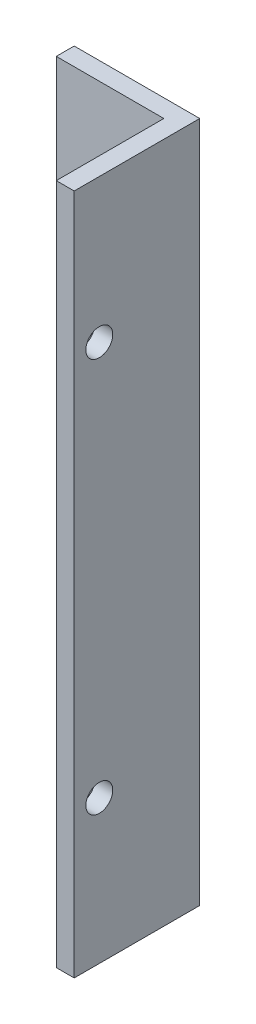
ISO-10303-21;
HEADER;
FILE_DESCRIPTION(('STEP AP214'),'2;1');
FILE_NAME('part.step','',(''),(''),'','','');
FILE_SCHEMA(('AUTOMOTIVE_DESIGN { 1 0 10303 214 1 1 1 1 }'));
ENDSEC;
DATA;
#1=APPLICATION_CONTEXT('core data for automotive mechanical design processes');
#2=APPLICATION_PROTOCOL_DEFINITION('international standard','automotive_design',2000,#1);
#3=PRODUCT_CONTEXT('',#1,'mechanical');
#4=PRODUCT('Part','Part','',(#3));
#5=PRODUCT_RELATED_PRODUCT_CATEGORY('part','',(#4));
#6=PRODUCT_DEFINITION_FORMATION('','',#4);
#7=PRODUCT_DEFINITION_CONTEXT('part definition',#1,'design');
#8=PRODUCT_DEFINITION('design','',#6,#7);
#9=PRODUCT_DEFINITION_SHAPE('','',#8);
#10=(LENGTH_UNIT() NAMED_UNIT(*) SI_UNIT(.MILLI.,.METRE.));
#11=(NAMED_UNIT(*) PLANE_ANGLE_UNIT() SI_UNIT($,.RADIAN.));
#12=(NAMED_UNIT(*) SI_UNIT($,.STERADIAN.) SOLID_ANGLE_UNIT());
#13=UNCERTAINTY_MEASURE_WITH_UNIT(LENGTH_MEASURE(1.E-05),#10,'distance_accuracy_value','');
#14=(GEOMETRIC_REPRESENTATION_CONTEXT(3) GLOBAL_UNCERTAINTY_ASSIGNED_CONTEXT((#13)) GLOBAL_UNIT_ASSIGNED_CONTEXT((#10,
#11,#12)) REPRESENTATION_CONTEXT('',''));
#15=CARTESIAN_POINT('',(0.,0.,0.));
#16=DIRECTION('',(0.,0.,1.));
#17=DIRECTION('',(1.,0.,0.));
#18=AXIS2_PLACEMENT_3D('',#15,#16,#17);
#19=CARTESIAN_POINT('',(-2.,76.,0.));
#20=DIRECTION('',(0.,0.,-1.));
#21=DIRECTION('',(-1.,0.,0.));
#22=AXIS2_PLACEMENT_3D('',#19,#20,#21);
#23=PLANE('',#22);
#24=DIRECTION('',(1.,0.,0.));
#25=VECTOR('',#24,1.);
#26=CARTESIAN_POINT('',(-2.,0.,0.));
#27=LINE('',#26,#25);
#28=CARTESIAN_POINT('',(-2.,0.,0.));
#29=VERTEX_POINT('',#28);
#30=CARTESIAN_POINT('',(0.,0.,0.));
#31=VERTEX_POINT('',#30);
#32=EDGE_CURVE('E121',#29,#31,#27,.T.);
#33=ORIENTED_EDGE('',*,*,#32,.T.);
#34=DIRECTION('',(0.,-1.,0.));
#35=VECTOR('',#34,1.);
#36=CARTESIAN_POINT('',(0.,76.,0.));
#37=LINE('',#36,#35);
#38=CARTESIAN_POINT('',(0.,76.,0.));
#39=VERTEX_POINT('',#38);
#40=EDGE_CURVE('E11',#39,#31,#37,.T.);
#41=ORIENTED_EDGE('',*,*,#40,.F.);
#42=DIRECTION('',(1.,0.,0.));
#43=VECTOR('',#42,1.);
#44=CARTESIAN_POINT('',(-2.,76.,0.));
#45=LINE('',#44,#43);
#46=CARTESIAN_POINT('',(-2.,76.,0.));
#47=VERTEX_POINT('',#46);
#48=EDGE_CURVE('E132',#47,#39,#45,.T.);
#49=ORIENTED_EDGE('',*,*,#48,.F.);
#50=DIRECTION('',(0.,-1.,0.));
#51=VECTOR('',#50,1.);
#52=CARTESIAN_POINT('',(-2.,76.,0.));
#53=LINE('',#52,#51);
#54=EDGE_CURVE('E117',#47,#29,#53,.T.);
#55=ORIENTED_EDGE('',*,*,#54,.T.);
#56=EDGE_LOOP('',(#33,#41,#49,#55));
#57=FACE_BOUND('',#56,.T.);
#58=ADVANCED_FACE('F35',(#57),#23,.F.);
#59=CARTESIAN_POINT('',(0.,76.,0.));
#60=DIRECTION('',(-1.,0.,0.));
#61=DIRECTION('',(0.,0.,1.));
#62=AXIS2_PLACEMENT_3D('',#59,#60,#61);
#63=PLANE('',#62);
#64=CARTESIAN_POINT('',(0.,60.,-2.8));
#65=DIRECTION('',(1.,0.,0.));
#66=DIRECTION('',(0.,0.,-1.));
#67=AXIS2_PLACEMENT_3D('',#64,#65,#66);
#68=CIRCLE('',#67,1.5);
#69=CARTESIAN_POINT('',(0.,60.,-4.3));
#70=VERTEX_POINT('',#69);
#71=EDGE_CURVE('E141',#70,#70,#68,.T.);
#72=ORIENTED_EDGE('',*,*,#71,.F.);
#73=EDGE_LOOP('',(#72));
#74=FACE_BOUND('',#73,.T.);
#75=CARTESIAN_POINT('',(0.,16.,-2.8));
#76=DIRECTION('',(1.,0.,0.));
#77=DIRECTION('',(0.,0.,-1.));
#78=AXIS2_PLACEMENT_3D('',#75,#76,#77);
#79=CIRCLE('',#78,1.5);
#80=CARTESIAN_POINT('',(0.,16.,-4.3));
#81=VERTEX_POINT('',#80);
#82=EDGE_CURVE('E149',#81,#81,#79,.T.);
#83=ORIENTED_EDGE('',*,*,#82,.F.);
#84=EDGE_LOOP('',(#83));
#85=FACE_BOUND('',#84,.T.);
#86=DIRECTION('',(0.,0.,-1.));
#87=VECTOR('',#86,1.);
#88=CARTESIAN_POINT('',(0.,0.,0.));
#89=LINE('',#88,#87);
#90=CARTESIAN_POINT('',(0.,0.,-14.));
#91=VERTEX_POINT('',#90);
#92=EDGE_CURVE('E124',#31,#91,#89,.T.);
#93=ORIENTED_EDGE('',*,*,#92,.T.);
#94=DIRECTION('',(0.,-1.,0.));
#95=VECTOR('',#94,1.);
#96=CARTESIAN_POINT('',(0.,76.,-14.));
#97=LINE('',#96,#95);
#98=CARTESIAN_POINT('',(0.,76.,-14.));
#99=VERTEX_POINT('',#98);
#100=EDGE_CURVE('E44',#99,#91,#97,.T.);
#101=ORIENTED_EDGE('',*,*,#100,.F.);
#102=DIRECTION('',(0.,0.,-1.));
#103=VECTOR('',#102,1.);
#104=CARTESIAN_POINT('',(0.,76.,0.));
#105=LINE('',#104,#103);
#106=EDGE_CURVE('E90',#39,#99,#105,.T.);
#107=ORIENTED_EDGE('',*,*,#106,.F.);
#108=ORIENTED_EDGE('',*,*,#40,.T.);
#109=EDGE_LOOP('',(#93,#101,#107,#108));
#110=FACE_BOUND('',#109,.T.);
#111=ADVANCED_FACE('F165',(#74,#85,#110),#63,.F.);
#112=CARTESIAN_POINT('',(0.,76.,-14.));
#113=DIRECTION('',(0.,0.,1.));
#114=DIRECTION('',(1.,0.,0.));
#115=AXIS2_PLACEMENT_3D('',#112,#113,#114);
#116=PLANE('',#115);
#117=CARTESIAN_POINT('',(-7.,23.,-14.));
#118=DIRECTION('',(0.,0.,-1.));
#119=DIRECTION('',(-1.,0.,0.));
#120=AXIS2_PLACEMENT_3D('',#117,#118,#119);
#121=CIRCLE('',#120,2.5);
#122=CARTESIAN_POINT('',(-9.5,23.,-14.));
#123=VERTEX_POINT('',#122);
#124=EDGE_CURVE('E145',#123,#123,#121,.T.);
#125=ORIENTED_EDGE('',*,*,#124,.F.);
#126=EDGE_LOOP('',(#125));
#127=FACE_BOUND('',#126,.T.);
#128=CARTESIAN_POINT('',(-7.,53.,-14.));
#129=DIRECTION('',(0.,0.,-1.));
#130=DIRECTION('',(-1.,0.,0.));
#131=AXIS2_PLACEMENT_3D('',#128,#129,#130);
#132=CIRCLE('',#131,2.5);
#133=CARTESIAN_POINT('',(-9.5,53.,-14.));
#134=VERTEX_POINT('',#133);
#135=EDGE_CURVE('E151',#134,#134,#132,.T.);
#136=ORIENTED_EDGE('',*,*,#135,.F.);
#137=EDGE_LOOP('',(#136));
#138=FACE_BOUND('',#137,.T.);
#139=DIRECTION('',(-1.,0.,0.));
#140=VECTOR('',#139,1.);
#141=CARTESIAN_POINT('',(0.,0.,-14.));
#142=LINE('',#141,#140);
#143=CARTESIAN_POINT('',(-14.,0.,-14.));
#144=VERTEX_POINT('',#143);
#145=EDGE_CURVE('E127',#91,#144,#142,.T.);
#146=ORIENTED_EDGE('',*,*,#145,.T.);
#147=DIRECTION('',(0.,-1.,0.));
#148=VECTOR('',#147,1.);
#149=CARTESIAN_POINT('',(-14.,76.,-14.));
#150=LINE('',#149,#148);
#151=CARTESIAN_POINT('',(-14.,76.,-14.));
#152=VERTEX_POINT('',#151);
#153=EDGE_CURVE('E112',#152,#144,#150,.T.);
#154=ORIENTED_EDGE('',*,*,#153,.F.);
#155=DIRECTION('',(-1.,0.,0.));
#156=VECTOR('',#155,1.);
#157=CARTESIAN_POINT('',(0.,76.,-14.));
#158=LINE('',#157,#156);
#159=EDGE_CURVE('E103',#99,#152,#158,.T.);
#160=ORIENTED_EDGE('',*,*,#159,.F.);
#161=ORIENTED_EDGE('',*,*,#100,.T.);
#162=EDGE_LOOP('',(#146,#154,#160,#161));
#163=FACE_BOUND('',#162,.T.);
#164=ADVANCED_FACE('F168',(#127,#138,#163),#116,.F.);
#165=CARTESIAN_POINT('',(-14.,76.,-14.));
#166=DIRECTION('',(1.,0.,0.));
#167=DIRECTION('',(0.,0.,-1.));
#168=AXIS2_PLACEMENT_3D('',#165,#166,#167);
#169=PLANE('',#168);
#170=DIRECTION('',(0.,0.,1.));
#171=VECTOR('',#170,1.);
#172=CARTESIAN_POINT('',(-14.,0.,-14.));
#173=LINE('',#172,#171);
#174=CARTESIAN_POINT('',(-14.,0.,-12.));
#175=VERTEX_POINT('',#174);
#176=EDGE_CURVE('E111',#144,#175,#173,.T.);
#177=ORIENTED_EDGE('',*,*,#176,.T.);
#178=DIRECTION('',(0.,-1.,0.));
#179=VECTOR('',#178,1.);
#180=CARTESIAN_POINT('',(-14.,76.,-12.));
#181=LINE('',#180,#179);
#182=CARTESIAN_POINT('',(-14.,76.,-12.));
#183=VERTEX_POINT('',#182);
#184=EDGE_CURVE('E108',#183,#175,#181,.T.);
#185=ORIENTED_EDGE('',*,*,#184,.F.);
#186=DIRECTION('',(0.,0.,1.));
#187=VECTOR('',#186,1.);
#188=CARTESIAN_POINT('',(-14.,76.,-14.));
#189=LINE('',#188,#187);
#190=EDGE_CURVE('E97',#152,#183,#189,.T.);
#191=ORIENTED_EDGE('',*,*,#190,.F.);
#192=ORIENTED_EDGE('',*,*,#153,.T.);
#193=EDGE_LOOP('',(#177,#185,#191,#192));
#194=FACE_BOUND('',#193,.T.);
#195=ADVANCED_FACE('F109',(#194),#169,.F.);
#196=CARTESIAN_POINT('',(-14.,76.,-12.));
#197=DIRECTION('',(0.,0.,-1.));
#198=DIRECTION('',(-1.,0.,0.));
#199=AXIS2_PLACEMENT_3D('',#196,#197,#198);
#200=PLANE('',#199);
#201=CARTESIAN_POINT('',(-7.,23.,-12.));
#202=DIRECTION('',(0.,0.,-1.));
#203=DIRECTION('',(-1.,0.,0.));
#204=AXIS2_PLACEMENT_3D('',#201,#202,#203);
#205=CIRCLE('',#204,2.5);
#206=CARTESIAN_POINT('',(-9.5,23.,-12.));
#207=VERTEX_POINT('',#206);
#208=EDGE_CURVE('E38',#207,#207,#205,.T.);
#209=ORIENTED_EDGE('',*,*,#208,.T.);
#210=EDGE_LOOP('',(#209));
#211=FACE_BOUND('',#210,.T.);
#212=CARTESIAN_POINT('',(-7.,53.,-12.));
#213=DIRECTION('',(0.,0.,-1.));
#214=DIRECTION('',(-1.,0.,0.));
#215=AXIS2_PLACEMENT_3D('',#212,#213,#214);
#216=CIRCLE('',#215,2.5);
#217=CARTESIAN_POINT('',(-9.5,53.,-12.));
#218=VERTEX_POINT('',#217);
#219=EDGE_CURVE('E143',#218,#218,#216,.T.);
#220=ORIENTED_EDGE('',*,*,#219,.T.);
#221=EDGE_LOOP('',(#220));
#222=FACE_BOUND('',#221,.T.);
#223=DIRECTION('',(1.,0.,0.));
#224=VECTOR('',#223,1.);
#225=CARTESIAN_POINT('',(-14.,0.,-12.));
#226=LINE('',#225,#224);
#227=CARTESIAN_POINT('',(-2.,0.,-12.));
#228=VERTEX_POINT('',#227);
#229=EDGE_CURVE('E76',#175,#228,#226,.T.);
#230=ORIENTED_EDGE('',*,*,#229,.T.);
#231=DIRECTION('',(0.,-1.,0.));
#232=VECTOR('',#231,1.);
#233=CARTESIAN_POINT('',(-2.,76.,-12.));
#234=LINE('',#233,#232);
#235=CARTESIAN_POINT('',(-2.,76.,-12.));
#236=VERTEX_POINT('',#235);
#237=EDGE_CURVE('E113',#236,#228,#234,.T.);
#238=ORIENTED_EDGE('',*,*,#237,.F.);
#239=DIRECTION('',(1.,0.,0.));
#240=VECTOR('',#239,1.);
#241=CARTESIAN_POINT('',(-14.,76.,-12.));
#242=LINE('',#241,#240);
#243=EDGE_CURVE('E101',#183,#236,#242,.T.);
#244=ORIENTED_EDGE('',*,*,#243,.F.);
#245=ORIENTED_EDGE('',*,*,#184,.T.);
#246=EDGE_LOOP('',(#230,#238,#244,#245));
#247=FACE_BOUND('',#246,.T.);
#248=ADVANCED_FACE('F115',(#211,#222,#247),#200,.F.);
#249=CARTESIAN_POINT('',(-2.,76.,-12.));
#250=DIRECTION('',(1.,0.,0.));
#251=DIRECTION('',(0.,0.,-1.));
#252=AXIS2_PLACEMENT_3D('',#249,#250,#251);
#253=PLANE('',#252);
#254=CARTESIAN_POINT('',(-2.,60.,-2.8));
#255=DIRECTION('',(1.,0.,0.));
#256=DIRECTION('',(0.,0.,-1.));
#257=AXIS2_PLACEMENT_3D('',#254,#255,#256);
#258=CIRCLE('',#257,1.5);
#259=CARTESIAN_POINT('',(-2.,60.,-4.3));
#260=VERTEX_POINT('',#259);
#261=EDGE_CURVE('E125',#260,#260,#258,.T.);
#262=ORIENTED_EDGE('',*,*,#261,.T.);
#263=EDGE_LOOP('',(#262));
#264=FACE_BOUND('',#263,.T.);
#265=CARTESIAN_POINT('',(-2.,16.,-2.8));
#266=DIRECTION('',(1.,0.,0.));
#267=DIRECTION('',(0.,0.,-1.));
#268=AXIS2_PLACEMENT_3D('',#265,#266,#267);
#269=CIRCLE('',#268,1.5);
#270=CARTESIAN_POINT('',(-2.,16.,-4.3));
#271=VERTEX_POINT('',#270);
#272=EDGE_CURVE('E138',#271,#271,#269,.T.);
#273=ORIENTED_EDGE('',*,*,#272,.T.);
#274=EDGE_LOOP('',(#273));
#275=FACE_BOUND('',#274,.T.);
#276=DIRECTION('',(0.,0.,1.));
#277=VECTOR('',#276,1.);
#278=CARTESIAN_POINT('',(-2.,0.,-12.));
#279=LINE('',#278,#277);
#280=EDGE_CURVE('E82',#228,#29,#279,.T.);
#281=ORIENTED_EDGE('',*,*,#280,.T.);
#282=ORIENTED_EDGE('',*,*,#54,.F.);
#283=DIRECTION('',(0.,0.,1.));
#284=VECTOR('',#283,1.);
#285=CARTESIAN_POINT('',(-2.,76.,-12.));
#286=LINE('',#285,#284);
#287=EDGE_CURVE('E53',#236,#47,#286,.T.);
#288=ORIENTED_EDGE('',*,*,#287,.F.);
#289=ORIENTED_EDGE('',*,*,#237,.T.);
#290=EDGE_LOOP('',(#281,#282,#288,#289));
#291=FACE_BOUND('',#290,.T.);
#292=ADVANCED_FACE('F173',(#264,#275,#291),#253,.F.);
#293=CARTESIAN_POINT('',(0.,76.,0.));
#294=DIRECTION('',(0.,1.,0.));
#295=DIRECTION('',(0.,0.,1.));
#296=AXIS2_PLACEMENT_3D('',#293,#294,#295);
#297=PLANE('',#296);
#298=ORIENTED_EDGE('',*,*,#48,.T.);
#299=ORIENTED_EDGE('',*,*,#106,.T.);
#300=ORIENTED_EDGE('',*,*,#159,.T.);
#301=ORIENTED_EDGE('',*,*,#190,.T.);
#302=ORIENTED_EDGE('',*,*,#243,.T.);
#303=ORIENTED_EDGE('',*,*,#287,.T.);
#304=EDGE_LOOP('',(#298,#299,#300,#301,#302,#303));
#305=FACE_BOUND('',#304,.T.);
#306=ADVANCED_FACE('F99',(#305),#297,.T.);
#307=CARTESIAN_POINT('',(0.,0.,0.));
#308=DIRECTION('',(0.,1.,0.));
#309=DIRECTION('',(0.,0.,1.));
#310=AXIS2_PLACEMENT_3D('',#307,#308,#309);
#311=PLANE('',#310);
#312=ORIENTED_EDGE('',*,*,#32,.F.);
#313=ORIENTED_EDGE('',*,*,#280,.F.);
#314=ORIENTED_EDGE('',*,*,#229,.F.);
#315=ORIENTED_EDGE('',*,*,#176,.F.);
#316=ORIENTED_EDGE('',*,*,#145,.F.);
#317=ORIENTED_EDGE('',*,*,#92,.F.);
#318=EDGE_LOOP('',(#312,#313,#314,#315,#316,#317));
#319=FACE_BOUND('',#318,.T.);
#320=ADVANCED_FACE('F171',(#319),#311,.F.);
#321=CARTESIAN_POINT('',(-76.,16.,-2.8));
#322=DIRECTION('',(1.,0.,0.));
#323=DIRECTION('',(0.,0.,-1.));
#324=AXIS2_PLACEMENT_3D('',#321,#322,#323);
#325=CYLINDRICAL_SURFACE('',#324,1.5);
#326=ORIENTED_EDGE('',*,*,#82,.T.);
#327=EDGE_LOOP('',(#326));
#328=FACE_BOUND('',#327,.T.);
#329=ORIENTED_EDGE('',*,*,#272,.F.);
#330=EDGE_LOOP('',(#329));
#331=FACE_BOUND('',#330,.T.);
#332=ADVANCED_FACE('F242',(#328,#331),#325,.F.);
#333=CARTESIAN_POINT('',(-76.,60.,-2.8));
#334=DIRECTION('',(1.,0.,0.));
#335=DIRECTION('',(0.,0.,-1.));
#336=AXIS2_PLACEMENT_3D('',#333,#334,#335);
#337=CYLINDRICAL_SURFACE('',#336,1.5);
#338=ORIENTED_EDGE('',*,*,#71,.T.);
#339=EDGE_LOOP('',(#338));
#340=FACE_BOUND('',#339,.T.);
#341=ORIENTED_EDGE('',*,*,#261,.F.);
#342=EDGE_LOOP('',(#341));
#343=FACE_BOUND('',#342,.T.);
#344=ADVANCED_FACE('F224',(#340,#343),#337,.F.);
#345=CARTESIAN_POINT('',(-7.,53.,62.));
#346=DIRECTION('',(0.,0.,-1.));
#347=DIRECTION('',(-1.,0.,0.));
#348=AXIS2_PLACEMENT_3D('',#345,#346,#347);
#349=CYLINDRICAL_SURFACE('',#348,2.5);
#350=ORIENTED_EDGE('',*,*,#135,.T.);
#351=EDGE_LOOP('',(#350));
#352=FACE_BOUND('',#351,.T.);
#353=ORIENTED_EDGE('',*,*,#219,.F.);
#354=EDGE_LOOP('',(#353));
#355=FACE_BOUND('',#354,.T.);
#356=ADVANCED_FACE('F218',(#352,#355),#349,.F.);
#357=CARTESIAN_POINT('',(-7.,23.,62.));
#358=DIRECTION('',(0.,0.,-1.));
#359=DIRECTION('',(-1.,0.,0.));
#360=AXIS2_PLACEMENT_3D('',#357,#358,#359);
#361=CYLINDRICAL_SURFACE('',#360,2.5);
#362=ORIENTED_EDGE('',*,*,#124,.T.);
#363=EDGE_LOOP('',(#362));
#364=FACE_BOUND('',#363,.T.);
#365=ORIENTED_EDGE('',*,*,#208,.F.);
#366=EDGE_LOOP('',(#365));
#367=FACE_BOUND('',#366,.T.);
#368=ADVANCED_FACE('F223',(#364,#367),#361,.F.);
#369=CLOSED_SHELL('',(#58,#111,#164,#195,#248,#292,#306,#320,#332,#344,#356,#368));
#370=MANIFOLD_SOLID_BREP('B2',#369);
#371=ADVANCED_BREP_SHAPE_REPRESENTATION('',(#18,#370),#14);
#372=SHAPE_DEFINITION_REPRESENTATION(#9,#371);
ENDSEC;
END-ISO-10303-21;
